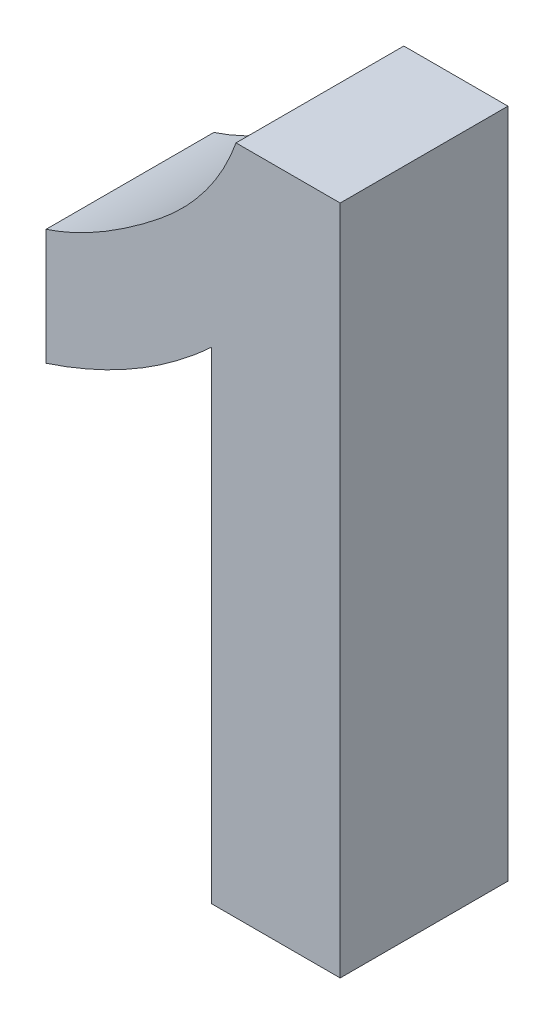
ISO-10303-21;
HEADER;
FILE_DESCRIPTION(('STEP AP214'),'2;1');
FILE_NAME('part.step','',(''),(''),'','','');
FILE_SCHEMA(('AUTOMOTIVE_DESIGN { 1 0 10303 214 1 1 1 1 }'));
ENDSEC;
DATA;
#1=APPLICATION_CONTEXT('core data for automotive mechanical design processes');
#2=APPLICATION_PROTOCOL_DEFINITION('international standard','automotive_design',2000,#1);
#3=PRODUCT_CONTEXT('',#1,'mechanical');
#4=PRODUCT('Part','Part','',(#3));
#5=PRODUCT_RELATED_PRODUCT_CATEGORY('part','',(#4));
#6=PRODUCT_DEFINITION_FORMATION('','',#4);
#7=PRODUCT_DEFINITION_CONTEXT('part definition',#1,'design');
#8=PRODUCT_DEFINITION('design','',#6,#7);
#9=PRODUCT_DEFINITION_SHAPE('','',#8);
#10=(LENGTH_UNIT() NAMED_UNIT(*) SI_UNIT(.MILLI.,.METRE.));
#11=(NAMED_UNIT(*) PLANE_ANGLE_UNIT() SI_UNIT($,.RADIAN.));
#12=(NAMED_UNIT(*) SI_UNIT($,.STERADIAN.) SOLID_ANGLE_UNIT());
#13=UNCERTAINTY_MEASURE_WITH_UNIT(LENGTH_MEASURE(1.E-05),#10,'distance_accuracy_value','');
#14=(GEOMETRIC_REPRESENTATION_CONTEXT(3) GLOBAL_UNCERTAINTY_ASSIGNED_CONTEXT((#13)) GLOBAL_UNIT_ASSIGNED_CONTEXT((#10,
#11,#12)) REPRESENTATION_CONTEXT('',''));
#15=CARTESIAN_POINT('',(0.,0.,0.));
#16=DIRECTION('',(0.,0.,1.));
#17=DIRECTION('',(1.,0.,0.));
#18=AXIS2_PLACEMENT_3D('',#15,#16,#17);
#19=CARTESIAN_POINT('',(-0.644586186389,0.350199806561,0.674985954115));
#20=DIRECTION('',(-1.,0.,0.));
#21=DIRECTION('',(0.,0.,1.));
#22=AXIS2_PLACEMENT_3D('',#19,#20,#21);
#23=PLANE('',#22);
#24=DIRECTION('',(0.,0.,1.));
#25=VECTOR('',#24,1.);
#26=CARTESIAN_POINT('',(-0.644586186389,0.41933560903,0.724985954115));
#27=LINE('',#26,#25);
#28=CARTESIAN_POINT('',(-0.644586186389,0.41933560903,0.674985954115));
#29=VERTEX_POINT('',#28);
#30=CARTESIAN_POINT('',(-0.644586186389,0.41933560903,0.774985954115));
#31=VERTEX_POINT('',#30);
#32=EDGE_CURVE('E93',#29,#31,#27,.T.);
#33=ORIENTED_EDGE('',*,*,#32,.F.);
#34=DIRECTION('',(0.,1.,0.));
#35=VECTOR('',#34,1.);
#36=CARTESIAN_POINT('',(-0.644586186389,0.120570176931,0.674985954115));
#37=LINE('',#36,#35);
#38=CARTESIAN_POINT('',(-0.644586186389,0.350199806561,0.674985954115));
#39=VERTEX_POINT('',#38);
#40=EDGE_CURVE('E113',#39,#29,#37,.T.);
#41=ORIENTED_EDGE('',*,*,#40,.F.);
#42=DIRECTION('',(0.,0.,-1.));
#43=VECTOR('',#42,1.);
#44=CARTESIAN_POINT('',(-0.644586186389,0.350199806561,0.724985954115));
#45=LINE('',#44,#43);
#46=CARTESIAN_POINT('',(-0.644586186389,0.350199806561,0.774985954115));
#47=VERTEX_POINT('',#46);
#48=EDGE_CURVE('E78',#47,#39,#45,.T.);
#49=ORIENTED_EDGE('',*,*,#48,.F.);
#50=DIRECTION('',(0.,1.,0.));
#51=VECTOR('',#50,1.);
#52=CARTESIAN_POINT('',(-0.644586186389,0.120570176931,0.774985954115));
#53=LINE('',#52,#51);
#54=EDGE_CURVE('E106',#31,#47,#53,.F.);
#55=ORIENTED_EDGE('',*,*,#54,.F.);
#56=EDGE_LOOP('',(#33,#41,#49,#55));
#57=FACE_BOUND('',#56,.T.);
#58=ADVANCED_FACE('F16',(#57),#23,.T.);
#59=CARTESIAN_POINT('',(-0.644586186389,0.41933560903,0.674985954115));
#60=CARTESIAN_POINT('',(-0.614647910075,0.429173609081,0.674985954115));
#61=CARTESIAN_POINT('',(-0.579520586724,0.456584859501,0.674985954115));
#62=CARTESIAN_POINT('',(-0.544393263373,0.483996109922,0.674985954115));
#63=CARTESIAN_POINT('',(-0.531353129319,0.520570176931,0.674985954115));
#64=CARTESIAN_POINT('',(-0.644586186389,0.41933560903,0.774985954115));
#65=CARTESIAN_POINT('',(-0.614647910075,0.429173609081,0.774985954115));
#66=CARTESIAN_POINT('',(-0.579520586724,0.456584859501,0.774985954115));
#67=CARTESIAN_POINT('',(-0.544393263373,0.483996109922,0.774985954115));
#68=CARTESIAN_POINT('',(-0.531353129319,0.520570176931,0.774985954115));
#69=B_SPLINE_SURFACE_WITH_KNOTS('',1,2,((#59,#60,#61,#62,#63),(#64,#65,#66,#67,#68)),
.UNSPECIFIED.,.F.,.F.,.F.,(2,2),(3,2,3),(0.,0.1),(4.,5.,6.),.UNSPECIFIED.);
#70=DIRECTION('',(0.,0.,1.));
#71=VECTOR('',#70,1.);
#72=CARTESIAN_POINT('',(-0.531353129319241,0.520570176931,0.674985954115));
#73=LINE('',#72,#71);
#74=CARTESIAN_POINT('',(-0.531353129319241,0.520570176930662,0.674985954115));
#75=VERTEX_POINT('',#74);
#76=CARTESIAN_POINT('',(-0.531353129319124,0.520570176930991,0.774985954115));
#77=VERTEX_POINT('',#76);
#78=EDGE_CURVE('E108',#75,#77,#73,.T.);
#79=CARTESIAN_POINT('',(-0.644586186389,0.41933560903,0.674985954115));
#80=CARTESIAN_POINT('',(-0.63958442480906,0.420986742252078,0.674985954115));
#81=CARTESIAN_POINT('',(-0.63468767423969,0.422921000374157,0.674985954115));
#82=CARTESIAN_POINT('',(-0.625114967703895,0.427233212398531,0.674985954115));
#83=CARTESIAN_POINT('',(-0.620438216888989,0.429609385762579,0.674985954115));
#84=CARTESIAN_POINT('',(-0.606489425863151,0.437356771386231,0.674985954115));
#85=CARTESIAN_POINT('',(-0.597523296650829,0.443262631391872,0.674985954115));
#86=CARTESIAN_POINT('',(-0.581146595975641,0.45513063785556,0.674985954115));
#87=CARTESIAN_POINT('',(-0.573675565391764,0.461008618550801,0.674985954115));
#88=CARTESIAN_POINT('',(-0.559940135669883,0.473960604144276,0.674985954115));
#89=CARTESIAN_POINT('',(-0.553663284026184,0.481020635194519,0.674985954115));
#90=CARTESIAN_POINT('',(-0.544675787055199,0.49351479299302,0.674985954115));
#91=CARTESIAN_POINT('',(-0.541495818971433,0.498615541642178,0.674985954115));
#92=CARTESIAN_POINT('',(-0.535845050495196,0.509275459970919,0.674985954115));
#93=CARTESIAN_POINT('',(-0.533383500758884,0.514839516301489,0.674985954115));
#94=CARTESIAN_POINT('',(-0.53135312931961,0.52057017692929,0.674985954115));
#95=B_SPLINE_CURVE_WITH_KNOTS('',3,(#79,#80,#81,#82,#83,#84,#85,#86,#87,#88,#89,#90,#91,#92,#93,
#94),.UNSPECIFIED.,.F.,.F.,(4,2,2,2,2,2,2,4),(0.,0.015777735728541,0.0314932263821032,
0.0636340127697417,0.0920879849077662,0.120226680999649,0.138205206734783,0.156405936573701),.UNSPECIFIED.);
#96=EDGE_CURVE('E147',#29,#75,#95,.T.);
#97=CARTESIAN_POINT('',(-0.531353129319007,0.520570176930981,0.774985954115));
#98=CARTESIAN_POINT('',(-0.532800037835315,0.516507109697908,0.774985954115));
#99=CARTESIAN_POINT('',(-0.534457759417441,0.512522156912258,0.774985954115));
#100=CARTESIAN_POINT('',(-0.538167477178219,0.504747696912369,0.774985954115));
#101=CARTESIAN_POINT('',(-0.540218853991962,0.500957894380643,0.774985954115));
#102=CARTESIAN_POINT('',(-0.546867515951641,0.490024513801906,0.774985954115));
#103=CARTESIAN_POINT('',(-0.552001455710915,0.483201221870801,0.774985954115));
#104=CARTESIAN_POINT('',(-0.561407421901648,0.472676497499211,0.774985954115));
#105=CARTESIAN_POINT('',(-0.565383380065751,0.468699896110517,0.774985954115));
#106=CARTESIAN_POINT('',(-0.573736398911338,0.461183276413071,0.774985954115));
#107=CARTESIAN_POINT('',(-0.57811409453381,0.457643970699794,0.774985954115));
#108=CARTESIAN_POINT('',(-0.587073805143941,0.45078123865286,0.774985954115));
#109=CARTESIAN_POINT('',(-0.591656944810922,0.447459332487665,0.774985954115));
#110=CARTESIAN_POINT('',(-0.60100163774787,0.441082942525376,0.774985954115));
#111=CARTESIAN_POINT('',(-0.605763030614527,0.438028226179276,0.774985954115));
#112=CARTESIAN_POINT('',(-0.616042691733822,0.431948668815997,0.774985954115));
#113=CARTESIAN_POINT('',(-0.621586147095309,0.428965158438625,0.774985954115));
#114=CARTESIAN_POINT('',(-0.632900231463591,0.423640831926591,0.774985954115));
#115=CARTESIAN_POINT('',(-0.638667917243515,0.421293686649728,0.774985954115));
#116=CARTESIAN_POINT('',(-0.644586186389,0.41933560903,0.774985954115));
#117=B_SPLINE_CURVE_WITH_KNOTS('',3,(#97,#98,#99,#100,#101,#102,#103,#104,#105,#106,#107,#108,
#109,#110,#111,#112,#113,#114,#115,#116),.UNSPECIFIED.,.F.,.F.,(4,2,2,2,2,2,2,2,2,4),(0.,
0.0129280147931121,0.0258358533936605,0.0512888603570597,0.0681302369638252,0.084998705287453,
0.101974716418631,0.118935802301281,0.137788586905427,0.156446347155678),.UNSPECIFIED.);
#118=EDGE_CURVE('E22',#77,#31,#117,.T.);
#119=ORIENTED_EDGE('',*,*,#78,.F.);
#120=ORIENTED_EDGE('',*,*,#96,.F.);
#121=ORIENTED_EDGE('',*,*,#32,.T.);
#122=ORIENTED_EDGE('',*,*,#118,.F.);
#123=EDGE_LOOP('',(#119,#120,#121,#122));
#124=FACE_BOUND('',#123,.T.);
#125=ADVANCED_FACE('F134',(#124),#69,.T.);
#126=CARTESIAN_POINT('',(-0.54582075429,0.120570176931,0.674985954115));
#127=DIRECTION('',(-1.,0.,0.));
#128=DIRECTION('',(0.,0.,1.));
#129=AXIS2_PLACEMENT_3D('',#126,#127,#128);
#130=PLANE('',#129);
#131=DIRECTION('',(0.,0.,1.));
#132=VECTOR('',#131,1.);
#133=CARTESIAN_POINT('',(-0.54582075429,0.407954450908,0.724985954115));
#134=LINE('',#133,#132);
#135=CARTESIAN_POINT('',(-0.54582075429,0.407954450908,0.674985954115));
#136=VERTEX_POINT('',#135);
#137=CARTESIAN_POINT('',(-0.54582075429,0.407954450908,0.774985954115));
#138=VERTEX_POINT('',#137);
#139=EDGE_CURVE('E83',#136,#138,#134,.T.);
#140=ORIENTED_EDGE('',*,*,#139,.F.);
#141=DIRECTION('',(0.,1.,0.));
#142=VECTOR('',#141,1.);
#143=CARTESIAN_POINT('',(-0.54582075429,0.120570176931,0.674985954115));
#144=LINE('',#143,#142);
#145=CARTESIAN_POINT('',(-0.54582075429,0.120570176931,0.674985954115));
#146=VERTEX_POINT('',#145);
#147=EDGE_CURVE('E167',#146,#136,#144,.T.);
#148=ORIENTED_EDGE('',*,*,#147,.F.);
#149=DIRECTION('',(0.,0.,-1.));
#150=VECTOR('',#149,1.);
#151=CARTESIAN_POINT('',(-0.54582075429,0.120570176931,0.674985954115));
#152=LINE('',#151,#150);
#153=CARTESIAN_POINT('',(-0.54582075429,0.120570176931,0.774985954115));
#154=VERTEX_POINT('',#153);
#155=EDGE_CURVE('E98',#154,#146,#152,.T.);
#156=ORIENTED_EDGE('',*,*,#155,.F.);
#157=DIRECTION('',(0.,1.,0.));
#158=VECTOR('',#157,1.);
#159=CARTESIAN_POINT('',(-0.54582075429,0.120570176931,0.774985954115));
#160=LINE('',#159,#158);
#161=EDGE_CURVE('E96',#138,#154,#160,.F.);
#162=ORIENTED_EDGE('',*,*,#161,.F.);
#163=EDGE_LOOP('',(#140,#148,#156,#162));
#164=FACE_BOUND('',#163,.T.);
#165=ADVANCED_FACE('F97',(#164),#130,.T.);
#166=CARTESIAN_POINT('',(-0.54582075429,0.407954450908,0.674985954115));
#167=CARTESIAN_POINT('',(-0.587718901261,0.368911248096,0.674985954115));
#168=CARTESIAN_POINT('',(-0.644586186389,0.350199806561,0.674985954115));
#169=CARTESIAN_POINT('',(-0.54582075429,0.407954450908,0.774985954115));
#170=CARTESIAN_POINT('',(-0.587718901261,0.368911248096,0.774985954115));
#171=CARTESIAN_POINT('',(-0.644586186389,0.350199806561,0.774985954115));
#172=B_SPLINE_SURFACE_WITH_KNOTS('',1,2,((#166,#167,#168),(#169,#170,#171)),.UNSPECIFIED.,.F.,
.F.,.F.,(2,2),(3,3),(0.,0.1),(2.,3.),.UNSPECIFIED.);
#173=CARTESIAN_POINT('',(-0.54582075429,0.407954450908,0.674985954115));
#174=CARTESIAN_POINT('',(-0.587718901261,0.368911248096,0.674985954115));
#175=CARTESIAN_POINT('',(-0.644586186389,0.350199806561,0.674985954115));
#176=B_SPLINE_CURVE_WITH_KNOTS('',2,(#173,#174,#175),.UNSPECIFIED.,.F.,.F.,(3,3),(0.,1.),.UNSPECIFIED.);
#177=EDGE_CURVE('E89',#136,#39,#176,.T.);
#178=CARTESIAN_POINT('',(-0.644586186389,0.350199806561,0.774985954115));
#179=CARTESIAN_POINT('',(-0.587718901261,0.368911248096,0.774985954115));
#180=CARTESIAN_POINT('',(-0.54582075429,0.407954450908,0.774985954115));
#181=B_SPLINE_CURVE_WITH_KNOTS('',2,(#178,#179,#180),.UNSPECIFIED.,.F.,.F.,(3,3),(0.,1.),.UNSPECIFIED.);
#182=EDGE_CURVE('E86',#47,#138,#181,.T.);
#183=ORIENTED_EDGE('',*,*,#48,.T.);
#184=ORIENTED_EDGE('',*,*,#177,.F.);
#185=ORIENTED_EDGE('',*,*,#139,.T.);
#186=ORIENTED_EDGE('',*,*,#182,.F.);
#187=EDGE_LOOP('',(#183,#184,#185,#186));
#188=FACE_BOUND('',#187,.T.);
#189=ADVANCED_FACE('F18',(#188),#172,.T.);
#190=CARTESIAN_POINT('',(-0.531353129319,0.520570176931,0.674985954115));
#191=DIRECTION('',(0.,1.,0.));
#192=DIRECTION('',(0.,0.,1.));
#193=AXIS2_PLACEMENT_3D('',#190,#191,#192);
#194=PLANE('',#193);
#195=DIRECTION('',(0.,0.,-1.));
#196=VECTOR('',#195,1.);
#197=CARTESIAN_POINT('',(-0.469277544414,0.520570176931,0.674985954115));
#198=LINE('',#197,#196);
#199=CARTESIAN_POINT('',(-0.469277544414,0.520570176930577,0.674985954115));
#200=VERTEX_POINT('',#199);
#201=CARTESIAN_POINT('',(-0.469277544414,0.520570176931,0.774985954115));
#202=VERTEX_POINT('',#201);
#203=EDGE_CURVE('E166',#200,#202,#198,.F.);
#204=ORIENTED_EDGE('',*,*,#203,.F.);
#205=DIRECTION('',(-1.,0.,0.));
#206=VECTOR('',#205,1.);
#207=CARTESIAN_POINT('',(-0.644586186389,0.520570176930323,0.674985954115));
#208=LINE('',#207,#206);
#209=EDGE_CURVE('E153',#75,#200,#208,.F.);
#210=ORIENTED_EDGE('',*,*,#209,.F.);
#211=ORIENTED_EDGE('',*,*,#78,.T.);
#212=DIRECTION('',(1.,0.,0.));
#213=VECTOR('',#212,1.);
#214=CARTESIAN_POINT('',(-0.644586186389,0.520570176931,0.774985954115));
#215=LINE('',#214,#213);
#216=EDGE_CURVE('E101',#202,#77,#215,.F.);
#217=ORIENTED_EDGE('',*,*,#216,.F.);
#218=EDGE_LOOP('',(#204,#210,#211,#217));
#219=FACE_BOUND('',#218,.T.);
#220=ADVANCED_FACE('F126',(#219),#194,.T.);
#221=CARTESIAN_POINT('',(-0.644586186389,0.120570176931,0.774985954115));
#222=DIRECTION('',(0.,0.,1.));
#223=DIRECTION('',(1.,0.,0.));
#224=AXIS2_PLACEMENT_3D('',#221,#222,#223);
#225=PLANE('',#224);
#226=ORIENTED_EDGE('',*,*,#216,.T.);
#227=ORIENTED_EDGE('',*,*,#118,.T.);
#228=ORIENTED_EDGE('',*,*,#54,.T.);
#229=ORIENTED_EDGE('',*,*,#182,.T.);
#230=ORIENTED_EDGE('',*,*,#161,.T.);
#231=DIRECTION('',(1.,0.,0.));
#232=VECTOR('',#231,1.);
#233=CARTESIAN_POINT('',(-0.468512112315,0.120570176931,0.774985954115));
#234=LINE('',#233,#232);
#235=CARTESIAN_POINT('',(-0.469277544414,0.120570176931,0.774985954115));
#236=VERTEX_POINT('',#235);
#237=EDGE_CURVE('E185',#236,#154,#234,.F.);
#238=ORIENTED_EDGE('',*,*,#237,.F.);
#239=DIRECTION('',(0.,1.,0.));
#240=VECTOR('',#239,1.);
#241=CARTESIAN_POINT('',(-0.469277544414,0.520570176931,0.774985954115));
#242=LINE('',#241,#240);
#243=EDGE_CURVE('E192',#202,#236,#242,.F.);
#244=ORIENTED_EDGE('',*,*,#243,.F.);
#245=EDGE_LOOP('',(#226,#227,#228,#229,#230,#238,#244));
#246=FACE_BOUND('',#245,.T.);
#247=ADVANCED_FACE('F104',(#246),#225,.T.);
#248=CARTESIAN_POINT('',(-0.468512112315,0.120570176931,0.674985954115));
#249=DIRECTION('',(0.,-1.,0.));
#250=DIRECTION('',(0.,0.,-1.));
#251=AXIS2_PLACEMENT_3D('',#248,#249,#250);
#252=PLANE('',#251);
#253=ORIENTED_EDGE('',*,*,#155,.T.);
#254=DIRECTION('',(-1.,0.,0.));
#255=VECTOR('',#254,1.);
#256=CARTESIAN_POINT('',(-0.644586186389,0.120570176931,0.674985954115));
#257=LINE('',#256,#255);
#258=CARTESIAN_POINT('',(-0.469277544414,0.120570176931,0.674985954115));
#259=VERTEX_POINT('',#258);
#260=EDGE_CURVE('E41',#259,#146,#257,.T.);
#261=ORIENTED_EDGE('',*,*,#260,.F.);
#262=DIRECTION('',(0.,0.,-1.));
#263=VECTOR('',#262,1.);
#264=CARTESIAN_POINT('',(-0.469277544414,0.120570176931,0.674985954115));
#265=LINE('',#264,#263);
#266=EDGE_CURVE('E32',#236,#259,#265,.T.);
#267=ORIENTED_EDGE('',*,*,#266,.F.);
#268=ORIENTED_EDGE('',*,*,#237,.T.);
#269=EDGE_LOOP('',(#253,#261,#267,#268));
#270=FACE_BOUND('',#269,.T.);
#271=ADVANCED_FACE('F125',(#270),#252,.T.);
#272=CARTESIAN_POINT('',(-0.644586186389,0.120570176931,0.674985954115));
#273=DIRECTION('',(0.,0.,-1.));
#274=DIRECTION('',(-1.,0.,0.));
#275=AXIS2_PLACEMENT_3D('',#272,#273,#274);
#276=PLANE('',#275);
#277=ORIENTED_EDGE('',*,*,#147,.T.);
#278=ORIENTED_EDGE('',*,*,#177,.T.);
#279=ORIENTED_EDGE('',*,*,#40,.T.);
#280=ORIENTED_EDGE('',*,*,#96,.T.);
#281=ORIENTED_EDGE('',*,*,#209,.T.);
#282=DIRECTION('',(0.,1.,0.));
#283=VECTOR('',#282,1.);
#284=CARTESIAN_POINT('',(-0.469277544414,0.520570176931,0.674985954115));
#285=LINE('',#284,#283);
#286=EDGE_CURVE('E11',#259,#200,#285,.T.);
#287=ORIENTED_EDGE('',*,*,#286,.F.);
#288=ORIENTED_EDGE('',*,*,#260,.T.);
#289=EDGE_LOOP('',(#277,#278,#279,#280,#281,#287,#288));
#290=FACE_BOUND('',#289,.T.);
#291=ADVANCED_FACE('F156',(#290),#276,.T.);
#292=CARTESIAN_POINT('',(-0.469277544414,0.520570176931,0.674985954115));
#293=DIRECTION('',(1.,0.,0.));
#294=DIRECTION('',(0.,0.,-1.));
#295=AXIS2_PLACEMENT_3D('',#292,#293,#294);
#296=PLANE('',#295);
#297=ORIENTED_EDGE('',*,*,#266,.T.);
#298=ORIENTED_EDGE('',*,*,#286,.T.);
#299=ORIENTED_EDGE('',*,*,#203,.T.);
#300=ORIENTED_EDGE('',*,*,#243,.T.);
#301=EDGE_LOOP('',(#297,#298,#299,#300));
#302=FACE_BOUND('',#301,.T.);
#303=ADVANCED_FACE('F160',(#302),#296,.T.);
#304=CLOSED_SHELL('',(#58,#125,#165,#189,#220,#247,#271,#291,#303));
#305=MANIFOLD_SOLID_BREP('B1',#304);
#306=ADVANCED_BREP_SHAPE_REPRESENTATION('',(#18,#305),#14);
#307=SHAPE_DEFINITION_REPRESENTATION(#9,#306);
ENDSEC;
END-ISO-10303-21;
